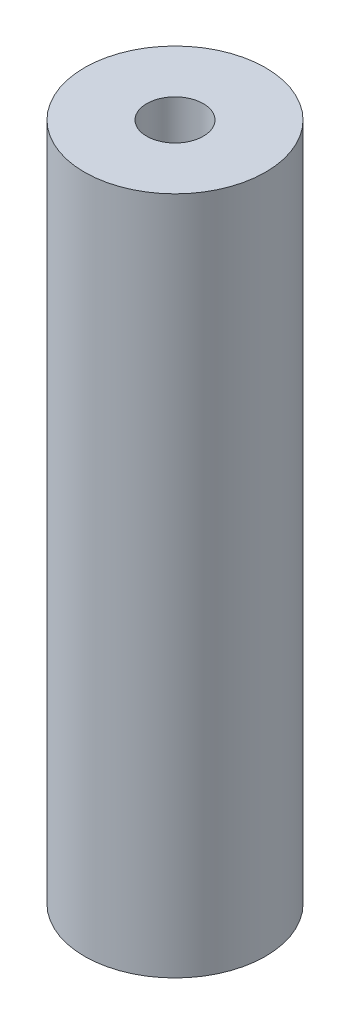
ISO-10303-21;
HEADER;
FILE_DESCRIPTION(('STEP AP214'),'2;1');
FILE_NAME('part.step','',(''),(''),'','','');
FILE_SCHEMA(('AUTOMOTIVE_DESIGN { 1 0 10303 214 1 1 1 1 }'));
ENDSEC;
DATA;
#1=APPLICATION_CONTEXT('core data for automotive mechanical design processes');
#2=APPLICATION_PROTOCOL_DEFINITION('international standard','automotive_design',2000,#1);
#3=PRODUCT_CONTEXT('',#1,'mechanical');
#4=PRODUCT('Part','Part','',(#3));
#5=PRODUCT_RELATED_PRODUCT_CATEGORY('part','',(#4));
#6=PRODUCT_DEFINITION_FORMATION('','',#4);
#7=PRODUCT_DEFINITION_CONTEXT('part definition',#1,'design');
#8=PRODUCT_DEFINITION('design','',#6,#7);
#9=PRODUCT_DEFINITION_SHAPE('','',#8);
#10=(LENGTH_UNIT() NAMED_UNIT(*) SI_UNIT(.MILLI.,.METRE.));
#11=(NAMED_UNIT(*) PLANE_ANGLE_UNIT() SI_UNIT($,.RADIAN.));
#12=(NAMED_UNIT(*) SI_UNIT($,.STERADIAN.) SOLID_ANGLE_UNIT());
#13=UNCERTAINTY_MEASURE_WITH_UNIT(LENGTH_MEASURE(1.E-05),#10,'distance_accuracy_value','');
#14=(GEOMETRIC_REPRESENTATION_CONTEXT(3) GLOBAL_UNCERTAINTY_ASSIGNED_CONTEXT((#13)) GLOBAL_UNIT_ASSIGNED_CONTEXT((#10,
#11,#12)) REPRESENTATION_CONTEXT('',''));
#15=CARTESIAN_POINT('',(0.,0.,0.));
#16=DIRECTION('',(0.,0.,1.));
#17=DIRECTION('',(1.,0.,0.));
#18=AXIS2_PLACEMENT_3D('',#15,#16,#17);
#19=CARTESIAN_POINT('',(0.,30.,0.));
#20=DIRECTION('',(0.,-1.,0.));
#21=DIRECTION('',(0.,0.,-1.));
#22=AXIS2_PLACEMENT_3D('',#19,#20,#21);
#23=CYLINDRICAL_SURFACE('',#22,4.);
#24=CARTESIAN_POINT('',(0.,30.,0.));
#25=DIRECTION('',(0.,1.,0.));
#26=DIRECTION('',(0.,0.,1.));
#27=AXIS2_PLACEMENT_3D('',#24,#25,#26);
#28=CIRCLE('',#27,4.);
#29=CARTESIAN_POINT('',(0.,30.,4.));
#30=VERTEX_POINT('',#29);
#31=EDGE_CURVE('E10',#30,#30,#28,.T.);
#32=ORIENTED_EDGE('',*,*,#31,.F.);
#33=EDGE_LOOP('',(#32));
#34=FACE_BOUND('',#33,.T.);
#35=CARTESIAN_POINT('',(0.,0.,0.));
#36=DIRECTION('',(0.,1.,0.));
#37=DIRECTION('',(0.,0.,1.));
#38=AXIS2_PLACEMENT_3D('',#35,#36,#37);
#39=CIRCLE('',#38,4.);
#40=CARTESIAN_POINT('',(0.,0.,4.));
#41=VERTEX_POINT('',#40);
#42=EDGE_CURVE('E39',#41,#41,#39,.T.);
#43=ORIENTED_EDGE('',*,*,#42,.T.);
#44=EDGE_LOOP('',(#43));
#45=FACE_BOUND('',#44,.T.);
#46=ADVANCED_FACE('F36',(#34,#45),#23,.T.);
#47=CARTESIAN_POINT('',(0.,30.,0.));
#48=DIRECTION('',(0.,1.,0.));
#49=DIRECTION('',(0.,0.,1.));
#50=AXIS2_PLACEMENT_3D('',#47,#48,#49);
#51=PLANE('',#50);
#52=CARTESIAN_POINT('',(0.,30.,0.));
#53=DIRECTION('',(0.,-1.,0.));
#54=DIRECTION('',(0.,0.,-1.));
#55=AXIS2_PLACEMENT_3D('',#52,#53,#54);
#56=CIRCLE('',#55,1.24999999999999);
#57=CARTESIAN_POINT('',(0.,30.,-1.24999999999999));
#58=VERTEX_POINT('',#57);
#59=EDGE_CURVE('E46',#58,#58,#56,.T.);
#60=ORIENTED_EDGE('',*,*,#59,.T.);
#61=EDGE_LOOP('',(#60));
#62=FACE_BOUND('',#61,.T.);
#63=ORIENTED_EDGE('',*,*,#31,.T.);
#64=EDGE_LOOP('',(#63));
#65=FACE_BOUND('',#64,.T.);
#66=ADVANCED_FACE('F59',(#62,#65),#51,.T.);
#67=CARTESIAN_POINT('',(0.,0.,0.));
#68=DIRECTION('',(0.,1.,0.));
#69=DIRECTION('',(0.,0.,1.));
#70=AXIS2_PLACEMENT_3D('',#67,#68,#69);
#71=PLANE('',#70);
#72=CARTESIAN_POINT('',(0.,0.,0.));
#73=DIRECTION('',(0.,-1.,0.));
#74=DIRECTION('',(0.,0.,-1.));
#75=AXIS2_PLACEMENT_3D('',#72,#73,#74);
#76=CIRCLE('',#75,1.25);
#77=CARTESIAN_POINT('',(0.,0.,-1.25));
#78=VERTEX_POINT('',#77);
#79=EDGE_CURVE('E50',#78,#78,#76,.T.);
#80=ORIENTED_EDGE('',*,*,#79,.F.);
#81=EDGE_LOOP('',(#80));
#82=FACE_BOUND('',#81,.T.);
#83=ORIENTED_EDGE('',*,*,#42,.F.);
#84=EDGE_LOOP('',(#83));
#85=FACE_BOUND('',#84,.T.);
#86=ADVANCED_FACE('F56',(#82,#85),#71,.F.);
#87=CARTESIAN_POINT('',(0.,0.,0.));
#88=DIRECTION('',(0.,-1.,0.));
#89=DIRECTION('',(0.,0.,-1.));
#90=AXIS2_PLACEMENT_3D('',#87,#88,#89);
#91=CYLINDRICAL_SURFACE('',#90,1.24999999999999);
#92=ORIENTED_EDGE('',*,*,#59,.F.);
#93=EDGE_LOOP('',(#92));
#94=FACE_BOUND('',#93,.T.);
#95=ORIENTED_EDGE('',*,*,#79,.T.);
#96=EDGE_LOOP('',(#95));
#97=FACE_BOUND('',#96,.T.);
#98=ADVANCED_FACE('F54',(#94,#97),#91,.F.);
#99=CLOSED_SHELL('',(#46,#66,#86,#98));
#100=MANIFOLD_SOLID_BREP('B2',#99);
#101=ADVANCED_BREP_SHAPE_REPRESENTATION('',(#18,#100),#14);
#102=SHAPE_DEFINITION_REPRESENTATION(#9,#101);
ENDSEC;
END-ISO-10303-21;
